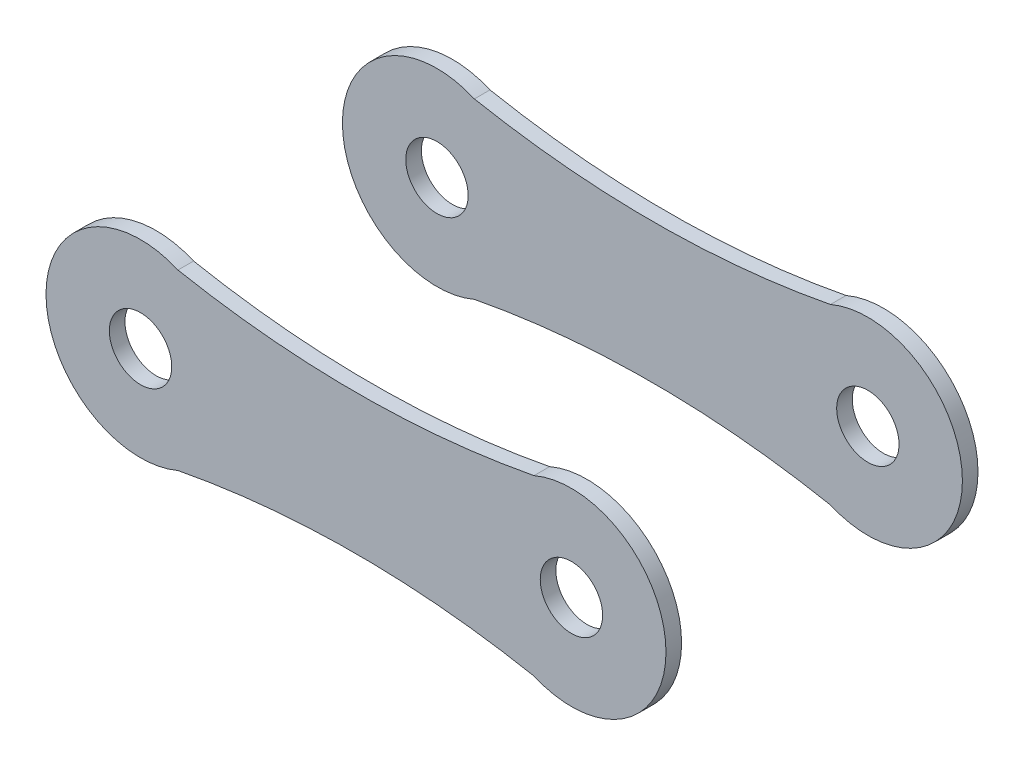
ISO-10303-21;
HEADER;
FILE_DESCRIPTION(('STEP AP214'),'2;1');
FILE_NAME('part.step','',(''),(''),'','','');
FILE_SCHEMA(('AUTOMOTIVE_DESIGN { 1 0 10303 214 1 1 1 1 }'));
ENDSEC;
DATA;
#1=APPLICATION_CONTEXT('core data for automotive mechanical design processes');
#2=APPLICATION_PROTOCOL_DEFINITION('international standard','automotive_design',2000,#1);
#3=PRODUCT_CONTEXT('',#1,'mechanical');
#4=PRODUCT('Part','Part','',(#3));
#5=PRODUCT_RELATED_PRODUCT_CATEGORY('part','',(#4));
#6=PRODUCT_DEFINITION_FORMATION('','',#4);
#7=PRODUCT_DEFINITION_CONTEXT('part definition',#1,'design');
#8=PRODUCT_DEFINITION('design','',#6,#7);
#9=PRODUCT_DEFINITION_SHAPE('','',#8);
#10=(LENGTH_UNIT() NAMED_UNIT(*) SI_UNIT(.MILLI.,.METRE.));
#11=(NAMED_UNIT(*) PLANE_ANGLE_UNIT() SI_UNIT($,.RADIAN.));
#12=(NAMED_UNIT(*) SI_UNIT($,.STERADIAN.) SOLID_ANGLE_UNIT());
#13=UNCERTAINTY_MEASURE_WITH_UNIT(LENGTH_MEASURE(1.E-05),#10,'distance_accuracy_value','');
#14=(GEOMETRIC_REPRESENTATION_CONTEXT(3) GLOBAL_UNCERTAINTY_ASSIGNED_CONTEXT((#13)) GLOBAL_UNIT_ASSIGNED_CONTEXT((#10,
#11,#12)) REPRESENTATION_CONTEXT('',''));
#15=CARTESIAN_POINT('',(0.,0.,0.));
#16=DIRECTION('',(0.,0.,1.));
#17=DIRECTION('',(1.,0.,0.));
#18=AXIS2_PLACEMENT_3D('',#15,#16,#17);
#19=CARTESIAN_POINT('',(6.90499999999999,32.4275703521993,-9.5));
#20=DIRECTION('',(0.,0.,1.));
#21=DIRECTION('',(1.,0.,0.));
#22=AXIS2_PLACEMENT_3D('',#19,#20,#21);
#23=CYLINDRICAL_SURFACE('',#22,30.1892576609959);
#24=CARTESIAN_POINT('',(6.90499999999999,32.4275703521993,-9.));
#25=DIRECTION('',(0.,0.,-1.));
#26=DIRECTION('',(-1.,0.,0.));
#27=AXIS2_PLACEMENT_3D('',#24,#25,#26);
#28=CIRCLE('',#27,30.1892576609959);
#29=CARTESIAN_POINT('',(12.6100653995277,2.78227549940501,-9.));
#30=VERTEX_POINT('',#29);
#31=CARTESIAN_POINT('',(1.19993460047229,2.78227549940501,-9.));
#32=VERTEX_POINT('',#31);
#33=EDGE_CURVE('E122',#30,#32,#28,.T.);
#34=ORIENTED_EDGE('',*,*,#33,.F.);
#35=DIRECTION('',(0.,0.,1.));
#36=VECTOR('',#35,1.);
#37=CARTESIAN_POINT('',(12.6100653995277,2.78227549940501,-9.5));
#38=LINE('',#37,#36);
#39=CARTESIAN_POINT('',(12.6100653995277,2.78227549940501,-9.5));
#40=VERTEX_POINT('',#39);
#41=EDGE_CURVE('E12',#40,#30,#38,.T.);
#42=ORIENTED_EDGE('',*,*,#41,.F.);
#43=CARTESIAN_POINT('',(6.90499999999999,32.4275703521993,-9.5));
#44=DIRECTION('',(0.,0.,-1.));
#45=DIRECTION('',(-1.,0.,0.));
#46=AXIS2_PLACEMENT_3D('',#43,#44,#45);
#47=CIRCLE('',#46,30.1892576609959);
#48=CARTESIAN_POINT('',(1.19993460047229,2.78227549940501,-9.5));
#49=VERTEX_POINT('',#48);
#50=EDGE_CURVE('E113',#40,#49,#47,.T.);
#51=ORIENTED_EDGE('',*,*,#50,.T.);
#52=DIRECTION('',(0.,0.,1.));
#53=VECTOR('',#52,1.);
#54=CARTESIAN_POINT('',(1.19993460047229,2.78227549940501,-9.5));
#55=LINE('',#54,#53);
#56=EDGE_CURVE('E93',#49,#32,#55,.T.);
#57=ORIENTED_EDGE('',*,*,#56,.T.);
#58=EDGE_LOOP('',(#34,#42,#51,#57));
#59=FACE_BOUND('',#58,.T.);
#60=ADVANCED_FACE('F49',(#59),#23,.F.);
#61=CARTESIAN_POINT('',(13.81,0.,-9.5));
#62=DIRECTION('',(0.,0.,1.));
#63=DIRECTION('',(1.,0.,0.));
#64=AXIS2_PLACEMENT_3D('',#61,#62,#63);
#65=CYLINDRICAL_SURFACE('',#64,3.03);
#66=CARTESIAN_POINT('',(13.81,0.,-9.));
#67=DIRECTION('',(0.,0.,1.));
#68=DIRECTION('',(1.,0.,0.));
#69=AXIS2_PLACEMENT_3D('',#66,#67,#68);
#70=CIRCLE('',#69,3.03);
#71=CARTESIAN_POINT('',(12.6100653995277,-2.78227549940501,-9.));
#72=VERTEX_POINT('',#71);
#73=EDGE_CURVE('E116',#72,#30,#70,.T.);
#74=ORIENTED_EDGE('',*,*,#73,.F.);
#75=DIRECTION('',(0.,0.,1.));
#76=VECTOR('',#75,1.);
#77=CARTESIAN_POINT('',(12.6100653995277,-2.78227549940501,-9.5));
#78=LINE('',#77,#76);
#79=CARTESIAN_POINT('',(12.6100653995277,-2.78227549940501,-9.5));
#80=VERTEX_POINT('',#79);
#81=EDGE_CURVE('E59',#80,#72,#78,.T.);
#82=ORIENTED_EDGE('',*,*,#81,.F.);
#83=CARTESIAN_POINT('',(13.81,0.,-9.5));
#84=DIRECTION('',(0.,0.,1.));
#85=DIRECTION('',(1.,0.,0.));
#86=AXIS2_PLACEMENT_3D('',#83,#84,#85);
#87=CIRCLE('',#86,3.03);
#88=EDGE_CURVE('E108',#80,#40,#87,.T.);
#89=ORIENTED_EDGE('',*,*,#88,.T.);
#90=ORIENTED_EDGE('',*,*,#41,.T.);
#91=EDGE_LOOP('',(#74,#82,#89,#90));
#92=FACE_BOUND('',#91,.T.);
#93=ADVANCED_FACE('F171',(#92),#65,.T.);
#94=CARTESIAN_POINT('',(6.90499999999999,-32.4275703521993,-9.5));
#95=DIRECTION('',(0.,0.,1.));
#96=DIRECTION('',(1.,0.,0.));
#97=AXIS2_PLACEMENT_3D('',#94,#95,#96);
#98=CYLINDRICAL_SURFACE('',#97,30.1892576609959);
#99=CARTESIAN_POINT('',(6.90499999999999,-32.4275703521993,-9.));
#100=DIRECTION('',(0.,0.,-1.));
#101=DIRECTION('',(1.,0.,0.));
#102=AXIS2_PLACEMENT_3D('',#99,#100,#101);
#103=CIRCLE('',#102,30.1892576609959);
#104=CARTESIAN_POINT('',(1.19993460047229,-2.78227549940501,-9.));
#105=VERTEX_POINT('',#104);
#106=EDGE_CURVE('E101',#105,#72,#103,.T.);
#107=ORIENTED_EDGE('',*,*,#106,.F.);
#108=DIRECTION('',(0.,0.,1.));
#109=VECTOR('',#108,1.);
#110=CARTESIAN_POINT('',(1.19993460047229,-2.78227549940501,-9.5));
#111=LINE('',#110,#109);
#112=CARTESIAN_POINT('',(1.19993460047229,-2.78227549940501,-9.5));
#113=VERTEX_POINT('',#112);
#114=EDGE_CURVE('E96',#113,#105,#111,.T.);
#115=ORIENTED_EDGE('',*,*,#114,.F.);
#116=CARTESIAN_POINT('',(6.90499999999999,-32.4275703521993,-9.5));
#117=DIRECTION('',(0.,0.,-1.));
#118=DIRECTION('',(1.,0.,0.));
#119=AXIS2_PLACEMENT_3D('',#116,#117,#118);
#120=CIRCLE('',#119,30.1892576609959);
#121=EDGE_CURVE('E99',#113,#80,#120,.T.);
#122=ORIENTED_EDGE('',*,*,#121,.T.);
#123=ORIENTED_EDGE('',*,*,#81,.T.);
#124=EDGE_LOOP('',(#107,#115,#122,#123));
#125=FACE_BOUND('',#124,.T.);
#126=ADVANCED_FACE('F98',(#125),#98,.F.);
#127=CARTESIAN_POINT('',(0.,0.,-9.5));
#128=DIRECTION('',(0.,0.,1.));
#129=DIRECTION('',(1.,0.,0.));
#130=AXIS2_PLACEMENT_3D('',#127,#128,#129);
#131=CYLINDRICAL_SURFACE('',#130,3.03);
#132=CARTESIAN_POINT('',(0.,0.,-9.));
#133=DIRECTION('',(0.,0.,1.));
#134=DIRECTION('',(1.,0.,0.));
#135=AXIS2_PLACEMENT_3D('',#132,#133,#134);
#136=CIRCLE('',#135,3.03);
#137=EDGE_CURVE('E126',#32,#105,#136,.T.);
#138=ORIENTED_EDGE('',*,*,#137,.F.);
#139=ORIENTED_EDGE('',*,*,#56,.F.);
#140=CARTESIAN_POINT('',(0.,0.,-9.5));
#141=DIRECTION('',(0.,0.,1.));
#142=DIRECTION('',(1.,0.,0.));
#143=AXIS2_PLACEMENT_3D('',#140,#141,#142);
#144=CIRCLE('',#143,3.03);
#145=EDGE_CURVE('E107',#49,#113,#144,.T.);
#146=ORIENTED_EDGE('',*,*,#145,.T.);
#147=ORIENTED_EDGE('',*,*,#114,.T.);
#148=EDGE_LOOP('',(#138,#139,#146,#147));
#149=FACE_BOUND('',#148,.T.);
#150=ADVANCED_FACE('F111',(#149),#131,.T.);
#151=CARTESIAN_POINT('',(3.4525,16.2137851760997,-9.5));
#152=DIRECTION('',(0.,0.,-1.));
#153=DIRECTION('',(-1.,0.,0.));
#154=AXIS2_PLACEMENT_3D('',#151,#152,#153);
#155=PLANE('',#154);
#156=CARTESIAN_POINT('',(13.81,0.,-9.5));
#157=DIRECTION('',(0.,0.,-1.));
#158=DIRECTION('',(-1.,0.,0.));
#159=AXIS2_PLACEMENT_3D('',#156,#157,#158);
#160=CIRCLE('',#159,1.);
#161=CARTESIAN_POINT('',(12.81,0.,-9.5));
#162=VERTEX_POINT('',#161);
#163=EDGE_CURVE('E127',#162,#162,#160,.T.);
#164=ORIENTED_EDGE('',*,*,#163,.F.);
#165=EDGE_LOOP('',(#164));
#166=FACE_BOUND('',#165,.T.);
#167=CARTESIAN_POINT('',(0.,0.,-9.5));
#168=DIRECTION('',(0.,0.,-1.));
#169=DIRECTION('',(-1.,0.,0.));
#170=AXIS2_PLACEMENT_3D('',#167,#168,#169);
#171=CIRCLE('',#170,1.);
#172=CARTESIAN_POINT('',(-1.,0.,-9.5));
#173=VERTEX_POINT('',#172);
#174=EDGE_CURVE('E141',#173,#173,#171,.T.);
#175=ORIENTED_EDGE('',*,*,#174,.F.);
#176=EDGE_LOOP('',(#175));
#177=FACE_BOUND('',#176,.T.);
#178=ORIENTED_EDGE('',*,*,#50,.F.);
#179=ORIENTED_EDGE('',*,*,#88,.F.);
#180=ORIENTED_EDGE('',*,*,#121,.F.);
#181=ORIENTED_EDGE('',*,*,#145,.F.);
#182=EDGE_LOOP('',(#178,#179,#180,#181));
#183=FACE_BOUND('',#182,.T.);
#184=ADVANCED_FACE('F106',(#166,#177,#183),#155,.T.);
#185=CARTESIAN_POINT('',(3.4525,16.2137851760997,-9.));
#186=DIRECTION('',(0.,0.,-1.));
#187=DIRECTION('',(-1.,0.,0.));
#188=AXIS2_PLACEMENT_3D('',#185,#186,#187);
#189=PLANE('',#188);
#190=CARTESIAN_POINT('',(13.81,0.,-9.));
#191=DIRECTION('',(0.,0.,-1.));
#192=DIRECTION('',(-1.,0.,0.));
#193=AXIS2_PLACEMENT_3D('',#190,#191,#192);
#194=CIRCLE('',#193,1.);
#195=CARTESIAN_POINT('',(12.81,0.,-9.));
#196=VERTEX_POINT('',#195);
#197=EDGE_CURVE('E52',#196,#196,#194,.T.);
#198=ORIENTED_EDGE('',*,*,#197,.T.);
#199=EDGE_LOOP('',(#198));
#200=FACE_BOUND('',#199,.T.);
#201=CARTESIAN_POINT('',(0.,0.,-9.));
#202=DIRECTION('',(0.,0.,-1.));
#203=DIRECTION('',(-1.,0.,0.));
#204=AXIS2_PLACEMENT_3D('',#201,#202,#203);
#205=CIRCLE('',#204,1.);
#206=CARTESIAN_POINT('',(-1.,0.,-9.));
#207=VERTEX_POINT('',#206);
#208=EDGE_CURVE('E138',#207,#207,#205,.T.);
#209=ORIENTED_EDGE('',*,*,#208,.T.);
#210=EDGE_LOOP('',(#209));
#211=FACE_BOUND('',#210,.T.);
#212=ORIENTED_EDGE('',*,*,#33,.T.);
#213=ORIENTED_EDGE('',*,*,#137,.T.);
#214=ORIENTED_EDGE('',*,*,#106,.T.);
#215=ORIENTED_EDGE('',*,*,#73,.T.);
#216=EDGE_LOOP('',(#212,#213,#214,#215));
#217=FACE_BOUND('',#216,.T.);
#218=ADVANCED_FACE('F160',(#200,#211,#217),#189,.F.);
#219=CARTESIAN_POINT('',(0.,0.,0.5));
#220=DIRECTION('',(0.,0.,-1.));
#221=DIRECTION('',(-1.,0.,0.));
#222=AXIS2_PLACEMENT_3D('',#219,#220,#221);
#223=CYLINDRICAL_SURFACE('',#222,1.);
#224=ORIENTED_EDGE('',*,*,#174,.T.);
#225=EDGE_LOOP('',(#224));
#226=FACE_BOUND('',#225,.T.);
#227=ORIENTED_EDGE('',*,*,#208,.F.);
#228=EDGE_LOOP('',(#227));
#229=FACE_BOUND('',#228,.T.);
#230=ADVANCED_FACE('F166',(#226,#229),#223,.F.);
#231=CARTESIAN_POINT('',(13.81,0.,0.5));
#232=DIRECTION('',(0.,0.,-1.));
#233=DIRECTION('',(-1.,0.,0.));
#234=AXIS2_PLACEMENT_3D('',#231,#232,#233);
#235=CYLINDRICAL_SURFACE('',#234,1.);
#236=ORIENTED_EDGE('',*,*,#163,.T.);
#237=EDGE_LOOP('',(#236));
#238=FACE_BOUND('',#237,.T.);
#239=ORIENTED_EDGE('',*,*,#197,.F.);
#240=EDGE_LOOP('',(#239));
#241=FACE_BOUND('',#240,.T.);
#242=ADVANCED_FACE('F155',(#238,#241),#235,.F.);
#243=CLOSED_SHELL('',(#60,#93,#126,#150,#184,#218,#230,#242));
#244=MANIFOLD_SOLID_BREP('B2',#243);
#245=CARTESIAN_POINT('',(6.905,32.4275703521958,0.5));
#246=DIRECTION('',(0.,0.,-1.));
#247=DIRECTION('',(-1.,0.,0.));
#248=AXIS2_PLACEMENT_3D('',#245,#246,#247);
#249=CYLINDRICAL_SURFACE('',#248,30.1892576609925);
#250=CARTESIAN_POINT('',(6.905,32.4275703521958,0.));
#251=DIRECTION('',(0.,0.,-1.));
#252=DIRECTION('',(1.,0.,0.));
#253=AXIS2_PLACEMENT_3D('',#250,#251,#252);
#254=CIRCLE('',#253,30.1892576609925);
#255=CARTESIAN_POINT('',(12.6100653995277,2.78227549940501,0.));
#256=VERTEX_POINT('',#255);
#257=CARTESIAN_POINT('',(1.19993460047229,2.78227549940501,0.));
#258=VERTEX_POINT('',#257);
#259=EDGE_CURVE('E297',#256,#258,#254,.T.);
#260=ORIENTED_EDGE('',*,*,#259,.T.);
#261=DIRECTION('',(0.,0.,-1.));
#262=VECTOR('',#261,1.);
#263=CARTESIAN_POINT('',(1.19993460047229,2.78227549940501,0.5));
#264=LINE('',#263,#262);
#265=CARTESIAN_POINT('',(1.19993460047229,2.78227549940501,0.5));
#266=VERTEX_POINT('',#265);
#267=EDGE_CURVE('E47',#266,#258,#264,.T.);
#268=ORIENTED_EDGE('',*,*,#267,.F.);
#269=CARTESIAN_POINT('',(6.905,32.4275703521958,0.5));
#270=DIRECTION('',(0.,0.,-1.));
#271=DIRECTION('',(1.,0.,0.));
#272=AXIS2_PLACEMENT_3D('',#269,#270,#271);
#273=CIRCLE('',#272,30.1892576609925);
#274=CARTESIAN_POINT('',(12.6100653995277,2.78227549940501,0.5));
#275=VERTEX_POINT('',#274);
#276=EDGE_CURVE('E284',#275,#266,#273,.T.);
#277=ORIENTED_EDGE('',*,*,#276,.F.);
#278=DIRECTION('',(0.,0.,-1.));
#279=VECTOR('',#278,1.);
#280=CARTESIAN_POINT('',(12.6100653995277,2.78227549940501,0.5));
#281=LINE('',#280,#279);
#282=EDGE_CURVE('E293',#275,#256,#281,.T.);
#283=ORIENTED_EDGE('',*,*,#282,.T.);
#284=EDGE_LOOP('',(#260,#268,#277,#283));
#285=FACE_BOUND('',#284,.T.);
#286=ADVANCED_FACE('F231',(#285),#249,.F.);
#287=CARTESIAN_POINT('',(0.,0.,0.5));
#288=DIRECTION('',(0.,0.,-1.));
#289=DIRECTION('',(-1.,0.,0.));
#290=AXIS2_PLACEMENT_3D('',#287,#288,#289);
#291=CYLINDRICAL_SURFACE('',#290,3.03);
#292=CARTESIAN_POINT('',(0.,0.,0.));
#293=DIRECTION('',(0.,0.,1.));
#294=DIRECTION('',(1.,0.,0.));
#295=AXIS2_PLACEMENT_3D('',#292,#293,#294);
#296=CIRCLE('',#295,3.03);
#297=CARTESIAN_POINT('',(1.19993460047228,-2.78227549940501,0.));
#298=VERTEX_POINT('',#297);
#299=EDGE_CURVE('E288',#258,#298,#296,.T.);
#300=ORIENTED_EDGE('',*,*,#299,.T.);
#301=DIRECTION('',(0.,0.,-1.));
#302=VECTOR('',#301,1.);
#303=CARTESIAN_POINT('',(1.19993460047228,-2.78227549940501,0.5));
#304=LINE('',#303,#302);
#305=CARTESIAN_POINT('',(1.19993460047228,-2.78227549940501,0.5));
#306=VERTEX_POINT('',#305);
#307=EDGE_CURVE('E240',#306,#298,#304,.T.);
#308=ORIENTED_EDGE('',*,*,#307,.F.);
#309=CARTESIAN_POINT('',(0.,0.,0.5));
#310=DIRECTION('',(0.,0.,1.));
#311=DIRECTION('',(1.,0.,0.));
#312=AXIS2_PLACEMENT_3D('',#309,#310,#311);
#313=CIRCLE('',#312,3.03);
#314=EDGE_CURVE('E279',#266,#306,#313,.T.);
#315=ORIENTED_EDGE('',*,*,#314,.F.);
#316=ORIENTED_EDGE('',*,*,#267,.T.);
#317=EDGE_LOOP('',(#300,#308,#315,#316));
#318=FACE_BOUND('',#317,.T.);
#319=ADVANCED_FACE('F287',(#318),#291,.T.);
#320=CARTESIAN_POINT('',(6.90499999999999,-32.4275703521958,0.5));
#321=DIRECTION('',(0.,0.,-1.));
#322=DIRECTION('',(-1.,0.,0.));
#323=AXIS2_PLACEMENT_3D('',#320,#321,#322);
#324=CYLINDRICAL_SURFACE('',#323,30.1892576609925);
#325=CARTESIAN_POINT('',(6.90499999999999,-32.4275703521958,0.));
#326=DIRECTION('',(0.,0.,-1.));
#327=DIRECTION('',(-1.,0.,0.));
#328=AXIS2_PLACEMENT_3D('',#325,#326,#327);
#329=CIRCLE('',#328,30.1892576609925);
#330=CARTESIAN_POINT('',(12.6100653995277,-2.78227549940501,0.));
#331=VERTEX_POINT('',#330);
#332=EDGE_CURVE('E266',#298,#331,#329,.T.);
#333=ORIENTED_EDGE('',*,*,#332,.T.);
#334=DIRECTION('',(0.,0.,-1.));
#335=VECTOR('',#334,1.);
#336=CARTESIAN_POINT('',(12.6100653995277,-2.78227549940501,0.5));
#337=LINE('',#336,#335);
#338=CARTESIAN_POINT('',(12.6100653995277,-2.78227549940501,0.5));
#339=VERTEX_POINT('',#338);
#340=EDGE_CURVE('E289',#339,#331,#337,.T.);
#341=ORIENTED_EDGE('',*,*,#340,.F.);
#342=CARTESIAN_POINT('',(6.90499999999999,-32.4275703521958,0.5));
#343=DIRECTION('',(0.,0.,-1.));
#344=DIRECTION('',(-1.,0.,0.));
#345=AXIS2_PLACEMENT_3D('',#342,#343,#344);
#346=CIRCLE('',#345,30.1892576609925);
#347=EDGE_CURVE('E282',#306,#339,#346,.T.);
#348=ORIENTED_EDGE('',*,*,#347,.F.);
#349=ORIENTED_EDGE('',*,*,#307,.T.);
#350=EDGE_LOOP('',(#333,#341,#348,#349));
#351=FACE_BOUND('',#350,.T.);
#352=ADVANCED_FACE('F291',(#351),#324,.F.);
#353=CARTESIAN_POINT('',(13.81,0.,0.5));
#354=DIRECTION('',(0.,0.,-1.));
#355=DIRECTION('',(-1.,0.,0.));
#356=AXIS2_PLACEMENT_3D('',#353,#354,#355);
#357=CYLINDRICAL_SURFACE('',#356,3.03);
#358=CARTESIAN_POINT('',(13.81,0.,0.));
#359=DIRECTION('',(0.,0.,1.));
#360=DIRECTION('',(1.,0.,0.));
#361=AXIS2_PLACEMENT_3D('',#358,#359,#360);
#362=CIRCLE('',#361,3.03);
#363=EDGE_CURVE('E272',#331,#256,#362,.T.);
#364=ORIENTED_EDGE('',*,*,#363,.T.);
#365=ORIENTED_EDGE('',*,*,#282,.F.);
#366=CARTESIAN_POINT('',(13.81,0.,0.5));
#367=DIRECTION('',(0.,0.,1.));
#368=DIRECTION('',(1.,0.,0.));
#369=AXIS2_PLACEMENT_3D('',#366,#367,#368);
#370=CIRCLE('',#369,3.03);
#371=EDGE_CURVE('E249',#339,#275,#370,.T.);
#372=ORIENTED_EDGE('',*,*,#371,.F.);
#373=ORIENTED_EDGE('',*,*,#340,.T.);
#374=EDGE_LOOP('',(#364,#365,#372,#373));
#375=FACE_BOUND('',#374,.T.);
#376=ADVANCED_FACE('F342',(#375),#357,.T.);
#377=CARTESIAN_POINT('',(10.3575,16.2137851760979,0.5));
#378=DIRECTION('',(0.,0.,1.));
#379=DIRECTION('',(1.,0.,0.));
#380=AXIS2_PLACEMENT_3D('',#377,#378,#379);
#381=PLANE('',#380);
#382=CARTESIAN_POINT('',(13.81,0.,0.5));
#383=DIRECTION('',(0.,0.,-1.));
#384=DIRECTION('',(-1.,0.,0.));
#385=AXIS2_PLACEMENT_3D('',#382,#383,#384);
#386=CIRCLE('',#385,1.);
#387=CARTESIAN_POINT('',(12.81,0.,0.5));
#388=VERTEX_POINT('',#387);
#389=EDGE_CURVE('E306',#388,#388,#386,.T.);
#390=ORIENTED_EDGE('',*,*,#389,.T.);
#391=EDGE_LOOP('',(#390));
#392=FACE_BOUND('',#391,.T.);
#393=CARTESIAN_POINT('',(0.,0.,0.5));
#394=DIRECTION('',(0.,0.,-1.));
#395=DIRECTION('',(-1.,0.,0.));
#396=AXIS2_PLACEMENT_3D('',#393,#394,#395);
#397=CIRCLE('',#396,1.);
#398=CARTESIAN_POINT('',(-1.,0.,0.5));
#399=VERTEX_POINT('',#398);
#400=EDGE_CURVE('E311',#399,#399,#397,.T.);
#401=ORIENTED_EDGE('',*,*,#400,.T.);
#402=EDGE_LOOP('',(#401));
#403=FACE_BOUND('',#402,.T.);
#404=ORIENTED_EDGE('',*,*,#276,.T.);
#405=ORIENTED_EDGE('',*,*,#314,.T.);
#406=ORIENTED_EDGE('',*,*,#347,.T.);
#407=ORIENTED_EDGE('',*,*,#371,.T.);
#408=EDGE_LOOP('',(#404,#405,#406,#407));
#409=FACE_BOUND('',#408,.T.);
#410=ADVANCED_FACE('F280',(#392,#403,#409),#381,.T.);
#411=CARTESIAN_POINT('',(10.3575,16.2137851760979,0.));
#412=DIRECTION('',(0.,0.,1.));
#413=DIRECTION('',(1.,0.,0.));
#414=AXIS2_PLACEMENT_3D('',#411,#412,#413);
#415=PLANE('',#414);
#416=CARTESIAN_POINT('',(13.81,0.,0.));
#417=DIRECTION('',(0.,0.,1.));
#418=DIRECTION('',(1.,0.,0.));
#419=AXIS2_PLACEMENT_3D('',#416,#417,#418);
#420=CIRCLE('',#419,1.);
#421=CARTESIAN_POINT('',(14.81,0.,0.));
#422=VERTEX_POINT('',#421);
#423=EDGE_CURVE('E234',#422,#422,#420,.T.);
#424=ORIENTED_EDGE('',*,*,#423,.T.);
#425=EDGE_LOOP('',(#424));
#426=FACE_BOUND('',#425,.T.);
#427=CARTESIAN_POINT('',(0.,0.,0.));
#428=DIRECTION('',(0.,0.,1.));
#429=DIRECTION('',(1.,0.,0.));
#430=AXIS2_PLACEMENT_3D('',#427,#428,#429);
#431=CIRCLE('',#430,1.);
#432=CARTESIAN_POINT('',(1.,0.,0.));
#433=VERTEX_POINT('',#432);
#434=EDGE_CURVE('E304',#433,#433,#431,.T.);
#435=ORIENTED_EDGE('',*,*,#434,.T.);
#436=EDGE_LOOP('',(#435));
#437=FACE_BOUND('',#436,.T.);
#438=ORIENTED_EDGE('',*,*,#259,.F.);
#439=ORIENTED_EDGE('',*,*,#363,.F.);
#440=ORIENTED_EDGE('',*,*,#332,.F.);
#441=ORIENTED_EDGE('',*,*,#299,.F.);
#442=EDGE_LOOP('',(#438,#439,#440,#441));
#443=FACE_BOUND('',#442,.T.);
#444=ADVANCED_FACE('F324',(#426,#437,#443),#415,.F.);
#445=CARTESIAN_POINT('',(0.,0.,0.5));
#446=DIRECTION('',(0.,0.,-1.));
#447=DIRECTION('',(-1.,0.,0.));
#448=AXIS2_PLACEMENT_3D('',#445,#446,#447);
#449=CYLINDRICAL_SURFACE('',#448,1.);
#450=ORIENTED_EDGE('',*,*,#400,.F.);
#451=EDGE_LOOP('',(#450));
#452=FACE_BOUND('',#451,.T.);
#453=ORIENTED_EDGE('',*,*,#434,.F.);
#454=EDGE_LOOP('',(#453));
#455=FACE_BOUND('',#454,.T.);
#456=ADVANCED_FACE('F320',(#452,#455),#449,.F.);
#457=CARTESIAN_POINT('',(13.81,0.,0.5));
#458=DIRECTION('',(0.,0.,-1.));
#459=DIRECTION('',(-1.,0.,0.));
#460=AXIS2_PLACEMENT_3D('',#457,#458,#459);
#461=CYLINDRICAL_SURFACE('',#460,1.);
#462=ORIENTED_EDGE('',*,*,#389,.F.);
#463=EDGE_LOOP('',(#462));
#464=FACE_BOUND('',#463,.T.);
#465=ORIENTED_EDGE('',*,*,#423,.F.);
#466=EDGE_LOOP('',(#465));
#467=FACE_BOUND('',#466,.T.);
#468=ADVANCED_FACE('F323',(#464,#467),#461,.F.);
#469=CLOSED_SHELL('',(#286,#319,#352,#376,#410,#444,#456,#468));
#470=MANIFOLD_SOLID_BREP('B6',#469);
#471=ADVANCED_BREP_SHAPE_REPRESENTATION('',(#18,#244,#470),#14);
#472=SHAPE_DEFINITION_REPRESENTATION(#9,#471);
ENDSEC;
END-ISO-10303-21;
